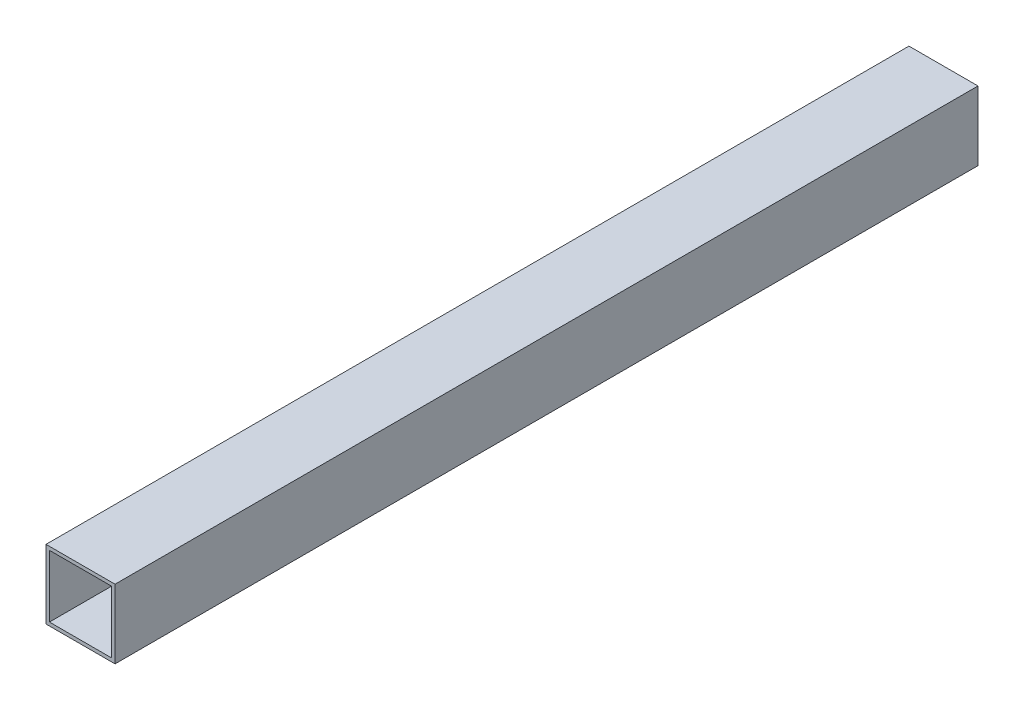
ISO-10303-21;
HEADER;
FILE_DESCRIPTION(('STEP AP214'),'2;1');
FILE_NAME('part.step','',(''),(''),'','','');
FILE_SCHEMA(('AUTOMOTIVE_DESIGN { 1 0 10303 214 1 1 1 1 }'));
ENDSEC;
DATA;
#1=APPLICATION_CONTEXT('core data for automotive mechanical design processes');
#2=APPLICATION_PROTOCOL_DEFINITION('international standard','automotive_design',2000,#1);
#3=PRODUCT_CONTEXT('',#1,'mechanical');
#4=PRODUCT('Part','Part','',(#3));
#5=PRODUCT_RELATED_PRODUCT_CATEGORY('part','',(#4));
#6=PRODUCT_DEFINITION_FORMATION('','',#4);
#7=PRODUCT_DEFINITION_CONTEXT('part definition',#1,'design');
#8=PRODUCT_DEFINITION('design','',#6,#7);
#9=PRODUCT_DEFINITION_SHAPE('','',#8);
#10=(LENGTH_UNIT() NAMED_UNIT(*) SI_UNIT(.MILLI.,.METRE.));
#11=(NAMED_UNIT(*) PLANE_ANGLE_UNIT() SI_UNIT($,.RADIAN.));
#12=(NAMED_UNIT(*) SI_UNIT($,.STERADIAN.) SOLID_ANGLE_UNIT());
#13=UNCERTAINTY_MEASURE_WITH_UNIT(LENGTH_MEASURE(1.E-05),#10,'distance_accuracy_value','');
#14=(GEOMETRIC_REPRESENTATION_CONTEXT(3) GLOBAL_UNCERTAINTY_ASSIGNED_CONTEXT((#13)) GLOBAL_UNIT_ASSIGNED_CONTEXT((#10,
#11,#12)) REPRESENTATION_CONTEXT('',''));
#15=CARTESIAN_POINT('',(0.,0.,0.));
#16=DIRECTION('',(0.,0.,1.));
#17=DIRECTION('',(1.,0.,0.));
#18=AXIS2_PLACEMENT_3D('',#15,#16,#17);
#19=CARTESIAN_POINT('',(-20.,-20.,500.));
#20=DIRECTION('',(0.,0.,1.));
#21=DIRECTION('',(1.,0.,0.));
#22=AXIS2_PLACEMENT_3D('',#19,#20,#21);
#23=PLANE('',#22);
#24=DIRECTION('',(0.,-1.,0.));
#25=VECTOR('',#24,1.);
#26=CARTESIAN_POINT('',(-20.,-20.,500.));
#27=LINE('',#26,#25);
#28=CARTESIAN_POINT('',(-20.,20.,500.));
#29=VERTEX_POINT('',#28);
#30=CARTESIAN_POINT('',(-20.,-20.,500.));
#31=VERTEX_POINT('',#30);
#32=EDGE_CURVE('E159',#29,#31,#27,.T.);
#33=ORIENTED_EDGE('',*,*,#32,.T.);
#34=DIRECTION('',(1.,0.,0.));
#35=VECTOR('',#34,1.);
#36=CARTESIAN_POINT('',(20.,-20.,500.));
#37=LINE('',#36,#35);
#38=CARTESIAN_POINT('',(20.,-20.,500.));
#39=VERTEX_POINT('',#38);
#40=EDGE_CURVE('E162',#31,#39,#37,.T.);
#41=ORIENTED_EDGE('',*,*,#40,.T.);
#42=DIRECTION('',(0.,1.,0.));
#43=VECTOR('',#42,1.);
#44=CARTESIAN_POINT('',(20.,-20.,500.));
#45=LINE('',#44,#43);
#46=CARTESIAN_POINT('',(20.,20.,500.));
#47=VERTEX_POINT('',#46);
#48=EDGE_CURVE('E165',#39,#47,#45,.T.);
#49=ORIENTED_EDGE('',*,*,#48,.T.);
#50=DIRECTION('',(-1.,0.,0.));
#51=VECTOR('',#50,1.);
#52=CARTESIAN_POINT('',(20.,20.,500.));
#53=LINE('',#52,#51);
#54=EDGE_CURVE('E167',#47,#29,#53,.T.);
#55=ORIENTED_EDGE('',*,*,#54,.T.);
#56=EDGE_LOOP('',(#33,#41,#49,#55));
#57=FACE_BOUND('',#56,.T.);
#58=DIRECTION('',(1.,0.,0.));
#59=VECTOR('',#58,1.);
#60=CARTESIAN_POINT('',(20.,-18.,500.));
#61=LINE('',#60,#59);
#62=CARTESIAN_POINT('',(-18.,-18.,500.));
#63=VERTEX_POINT('',#62);
#64=CARTESIAN_POINT('',(18.,-18.,500.));
#65=VERTEX_POINT('',#64);
#66=EDGE_CURVE('E131',#63,#65,#61,.T.);
#67=ORIENTED_EDGE('',*,*,#66,.F.);
#68=DIRECTION('',(0.,-1.,0.));
#69=VECTOR('',#68,1.);
#70=CARTESIAN_POINT('',(-18.,-20.,500.));
#71=LINE('',#70,#69);
#72=CARTESIAN_POINT('',(-18.,18.,500.));
#73=VERTEX_POINT('',#72);
#74=EDGE_CURVE('E123',#73,#63,#71,.T.);
#75=ORIENTED_EDGE('',*,*,#74,.F.);
#76=DIRECTION('',(-1.,0.,0.));
#77=VECTOR('',#76,1.);
#78=CARTESIAN_POINT('',(20.,18.,500.));
#79=LINE('',#78,#77);
#80=CARTESIAN_POINT('',(18.,18.,500.));
#81=VERTEX_POINT('',#80);
#82=EDGE_CURVE('E145',#81,#73,#79,.T.);
#83=ORIENTED_EDGE('',*,*,#82,.F.);
#84=DIRECTION('',(0.,1.,0.));
#85=VECTOR('',#84,1.);
#86=CARTESIAN_POINT('',(18.,-20.,500.));
#87=LINE('',#86,#85);
#88=EDGE_CURVE('E143',#65,#81,#87,.T.);
#89=ORIENTED_EDGE('',*,*,#88,.F.);
#90=EDGE_LOOP('',(#67,#75,#83,#89));
#91=FACE_BOUND('',#90,.T.);
#92=ADVANCED_FACE('F58',(#57,#91),#23,.T.);
#93=CARTESIAN_POINT('',(-20.,-20.,0.));
#94=DIRECTION('',(0.,0.,1.));
#95=DIRECTION('',(1.,0.,0.));
#96=AXIS2_PLACEMENT_3D('',#93,#94,#95);
#97=PLANE('',#96);
#98=DIRECTION('',(0.,-1.,0.));
#99=VECTOR('',#98,1.);
#100=CARTESIAN_POINT('',(-20.,-20.,0.));
#101=LINE('',#100,#99);
#102=CARTESIAN_POINT('',(-20.,20.,0.));
#103=VERTEX_POINT('',#102);
#104=CARTESIAN_POINT('',(-20.,-20.,0.));
#105=VERTEX_POINT('',#104);
#106=EDGE_CURVE('E139',#103,#105,#101,.T.);
#107=ORIENTED_EDGE('',*,*,#106,.F.);
#108=DIRECTION('',(-1.,0.,0.));
#109=VECTOR('',#108,1.);
#110=CARTESIAN_POINT('',(20.,20.,0.));
#111=LINE('',#110,#109);
#112=CARTESIAN_POINT('',(20.,20.,0.));
#113=VERTEX_POINT('',#112);
#114=EDGE_CURVE('E163',#113,#103,#111,.T.);
#115=ORIENTED_EDGE('',*,*,#114,.F.);
#116=DIRECTION('',(0.,1.,0.));
#117=VECTOR('',#116,1.);
#118=CARTESIAN_POINT('',(20.,-20.,0.));
#119=LINE('',#118,#117);
#120=CARTESIAN_POINT('',(20.,-20.,0.));
#121=VERTEX_POINT('',#120);
#122=EDGE_CURVE('E174',#121,#113,#119,.T.);
#123=ORIENTED_EDGE('',*,*,#122,.F.);
#124=DIRECTION('',(1.,0.,0.));
#125=VECTOR('',#124,1.);
#126=CARTESIAN_POINT('',(20.,-20.,0.));
#127=LINE('',#126,#125);
#128=EDGE_CURVE('E172',#105,#121,#127,.T.);
#129=ORIENTED_EDGE('',*,*,#128,.F.);
#130=EDGE_LOOP('',(#107,#115,#123,#129));
#131=FACE_BOUND('',#130,.T.);
#132=DIRECTION('',(0.,-1.,0.));
#133=VECTOR('',#132,1.);
#134=CARTESIAN_POINT('',(-18.,-20.,0.));
#135=LINE('',#134,#133);
#136=CARTESIAN_POINT('',(-18.,18.,0.));
#137=VERTEX_POINT('',#136);
#138=CARTESIAN_POINT('',(-18.,-18.,0.));
#139=VERTEX_POINT('',#138);
#140=EDGE_CURVE('E81',#137,#139,#135,.T.);
#141=ORIENTED_EDGE('',*,*,#140,.T.);
#142=DIRECTION('',(1.,0.,0.));
#143=VECTOR('',#142,1.);
#144=CARTESIAN_POINT('',(20.,-18.,0.));
#145=LINE('',#144,#143);
#146=CARTESIAN_POINT('',(18.,-18.,0.));
#147=VERTEX_POINT('',#146);
#148=EDGE_CURVE('E138',#139,#147,#145,.T.);
#149=ORIENTED_EDGE('',*,*,#148,.T.);
#150=DIRECTION('',(0.,1.,0.));
#151=VECTOR('',#150,1.);
#152=CARTESIAN_POINT('',(18.,-20.,0.));
#153=LINE('',#152,#151);
#154=CARTESIAN_POINT('',(18.,18.,0.));
#155=VERTEX_POINT('',#154);
#156=EDGE_CURVE('E151',#147,#155,#153,.T.);
#157=ORIENTED_EDGE('',*,*,#156,.T.);
#158=DIRECTION('',(-1.,0.,0.));
#159=VECTOR('',#158,1.);
#160=CARTESIAN_POINT('',(20.,18.,0.));
#161=LINE('',#160,#159);
#162=EDGE_CURVE('E132',#155,#137,#161,.T.);
#163=ORIENTED_EDGE('',*,*,#162,.T.);
#164=EDGE_LOOP('',(#141,#149,#157,#163));
#165=FACE_BOUND('',#164,.T.);
#166=ADVANCED_FACE('F192',(#131,#165),#97,.F.);
#167=CARTESIAN_POINT('',(-20.,-20.,500.));
#168=DIRECTION('',(1.,0.,0.));
#169=DIRECTION('',(0.,0.,-1.));
#170=AXIS2_PLACEMENT_3D('',#167,#168,#169);
#171=PLANE('',#170);
#172=ORIENTED_EDGE('',*,*,#106,.T.);
#173=DIRECTION('',(0.,0.,-1.));
#174=VECTOR('',#173,1.);
#175=CARTESIAN_POINT('',(-20.,-20.,500.));
#176=LINE('',#175,#174);
#177=EDGE_CURVE('E12',#31,#105,#176,.T.);
#178=ORIENTED_EDGE('',*,*,#177,.F.);
#179=ORIENTED_EDGE('',*,*,#32,.F.);
#180=DIRECTION('',(0.,0.,-1.));
#181=VECTOR('',#180,1.);
#182=CARTESIAN_POINT('',(-20.,20.,500.));
#183=LINE('',#182,#181);
#184=EDGE_CURVE('E169',#29,#103,#183,.T.);
#185=ORIENTED_EDGE('',*,*,#184,.T.);
#186=EDGE_LOOP('',(#172,#178,#179,#185));
#187=FACE_BOUND('',#186,.T.);
#188=ADVANCED_FACE('F60',(#187),#171,.F.);
#189=CARTESIAN_POINT('',(20.,-20.,500.));
#190=DIRECTION('',(0.,1.,0.));
#191=DIRECTION('',(-1.,0.,0.));
#192=AXIS2_PLACEMENT_3D('',#189,#190,#191);
#193=PLANE('',#192);
#194=ORIENTED_EDGE('',*,*,#128,.T.);
#195=DIRECTION('',(0.,0.,-1.));
#196=VECTOR('',#195,1.);
#197=CARTESIAN_POINT('',(20.,-20.,500.));
#198=LINE('',#197,#196);
#199=EDGE_CURVE('E66',#39,#121,#198,.T.);
#200=ORIENTED_EDGE('',*,*,#199,.F.);
#201=ORIENTED_EDGE('',*,*,#40,.F.);
#202=ORIENTED_EDGE('',*,*,#177,.T.);
#203=EDGE_LOOP('',(#194,#200,#201,#202));
#204=FACE_BOUND('',#203,.T.);
#205=ADVANCED_FACE('F202',(#204),#193,.F.);
#206=CARTESIAN_POINT('',(20.,-20.,500.));
#207=DIRECTION('',(-1.,0.,0.));
#208=DIRECTION('',(0.,0.,1.));
#209=AXIS2_PLACEMENT_3D('',#206,#207,#208);
#210=PLANE('',#209);
#211=ORIENTED_EDGE('',*,*,#122,.T.);
#212=DIRECTION('',(0.,0.,-1.));
#213=VECTOR('',#212,1.);
#214=CARTESIAN_POINT('',(20.,20.,500.));
#215=LINE('',#214,#213);
#216=EDGE_CURVE('E179',#47,#113,#215,.T.);
#217=ORIENTED_EDGE('',*,*,#216,.F.);
#218=ORIENTED_EDGE('',*,*,#48,.F.);
#219=ORIENTED_EDGE('',*,*,#199,.T.);
#220=EDGE_LOOP('',(#211,#217,#218,#219));
#221=FACE_BOUND('',#220,.T.);
#222=ADVANCED_FACE('F186',(#221),#210,.F.);
#223=CARTESIAN_POINT('',(20.,20.,500.));
#224=DIRECTION('',(0.,-1.,0.));
#225=DIRECTION('',(1.,0.,0.));
#226=AXIS2_PLACEMENT_3D('',#223,#224,#225);
#227=PLANE('',#226);
#228=ORIENTED_EDGE('',*,*,#114,.T.);
#229=ORIENTED_EDGE('',*,*,#184,.F.);
#230=ORIENTED_EDGE('',*,*,#54,.F.);
#231=ORIENTED_EDGE('',*,*,#216,.T.);
#232=EDGE_LOOP('',(#228,#229,#230,#231));
#233=FACE_BOUND('',#232,.T.);
#234=ADVANCED_FACE('F196',(#233),#227,.F.);
#235=CARTESIAN_POINT('',(-18.,-20.,500.));
#236=DIRECTION('',(1.,0.,0.));
#237=DIRECTION('',(0.,0.,-1.));
#238=AXIS2_PLACEMENT_3D('',#235,#236,#237);
#239=PLANE('',#238);
#240=ORIENTED_EDGE('',*,*,#140,.F.);
#241=DIRECTION('',(0.,0.,-1.));
#242=VECTOR('',#241,1.);
#243=CARTESIAN_POINT('',(-18.,18.,500.));
#244=LINE('',#243,#242);
#245=EDGE_CURVE('E127',#73,#137,#244,.T.);
#246=ORIENTED_EDGE('',*,*,#245,.F.);
#247=ORIENTED_EDGE('',*,*,#74,.T.);
#248=DIRECTION('',(0.,0.,-1.));
#249=VECTOR('',#248,1.);
#250=CARTESIAN_POINT('',(-18.,-18.,500.));
#251=LINE('',#250,#249);
#252=EDGE_CURVE('E126',#63,#139,#251,.T.);
#253=ORIENTED_EDGE('',*,*,#252,.T.);
#254=EDGE_LOOP('',(#240,#246,#247,#253));
#255=FACE_BOUND('',#254,.T.);
#256=ADVANCED_FACE('F125',(#255),#239,.T.);
#257=CARTESIAN_POINT('',(20.,-18.,500.));
#258=DIRECTION('',(0.,1.,0.));
#259=DIRECTION('',(-1.,0.,0.));
#260=AXIS2_PLACEMENT_3D('',#257,#258,#259);
#261=PLANE('',#260);
#262=ORIENTED_EDGE('',*,*,#148,.F.);
#263=ORIENTED_EDGE('',*,*,#252,.F.);
#264=ORIENTED_EDGE('',*,*,#66,.T.);
#265=DIRECTION('',(0.,0.,-1.));
#266=VECTOR('',#265,1.);
#267=CARTESIAN_POINT('',(18.,-18.,500.));
#268=LINE('',#267,#266);
#269=EDGE_CURVE('E140',#65,#147,#268,.T.);
#270=ORIENTED_EDGE('',*,*,#269,.T.);
#271=EDGE_LOOP('',(#262,#263,#264,#270));
#272=FACE_BOUND('',#271,.T.);
#273=ADVANCED_FACE('F135',(#272),#261,.T.);
#274=CARTESIAN_POINT('',(18.,-20.,500.));
#275=DIRECTION('',(-1.,0.,0.));
#276=DIRECTION('',(0.,0.,1.));
#277=AXIS2_PLACEMENT_3D('',#274,#275,#276);
#278=PLANE('',#277);
#279=ORIENTED_EDGE('',*,*,#156,.F.);
#280=ORIENTED_EDGE('',*,*,#269,.F.);
#281=ORIENTED_EDGE('',*,*,#88,.T.);
#282=DIRECTION('',(0.,0.,-1.));
#283=VECTOR('',#282,1.);
#284=CARTESIAN_POINT('',(18.,18.,500.));
#285=LINE('',#284,#283);
#286=EDGE_CURVE('E73',#81,#155,#285,.T.);
#287=ORIENTED_EDGE('',*,*,#286,.T.);
#288=EDGE_LOOP('',(#279,#280,#281,#287));
#289=FACE_BOUND('',#288,.T.);
#290=ADVANCED_FACE('F225',(#289),#278,.T.);
#291=CARTESIAN_POINT('',(20.,18.,500.));
#292=DIRECTION('',(0.,-1.,0.));
#293=DIRECTION('',(1.,0.,0.));
#294=AXIS2_PLACEMENT_3D('',#291,#292,#293);
#295=PLANE('',#294);
#296=ORIENTED_EDGE('',*,*,#162,.F.);
#297=ORIENTED_EDGE('',*,*,#286,.F.);
#298=ORIENTED_EDGE('',*,*,#82,.T.);
#299=ORIENTED_EDGE('',*,*,#245,.T.);
#300=EDGE_LOOP('',(#296,#297,#298,#299));
#301=FACE_BOUND('',#300,.T.);
#302=ADVANCED_FACE('F229',(#301),#295,.T.);
#303=CLOSED_SHELL('',(#92,#166,#188,#205,#222,#234,#256,#273,#290,#302));
#304=MANIFOLD_SOLID_BREP('B2',#303);
#305=ADVANCED_BREP_SHAPE_REPRESENTATION('',(#18,#304),#14);
#306=SHAPE_DEFINITION_REPRESENTATION(#9,#305);
ENDSEC;
END-ISO-10303-21;
